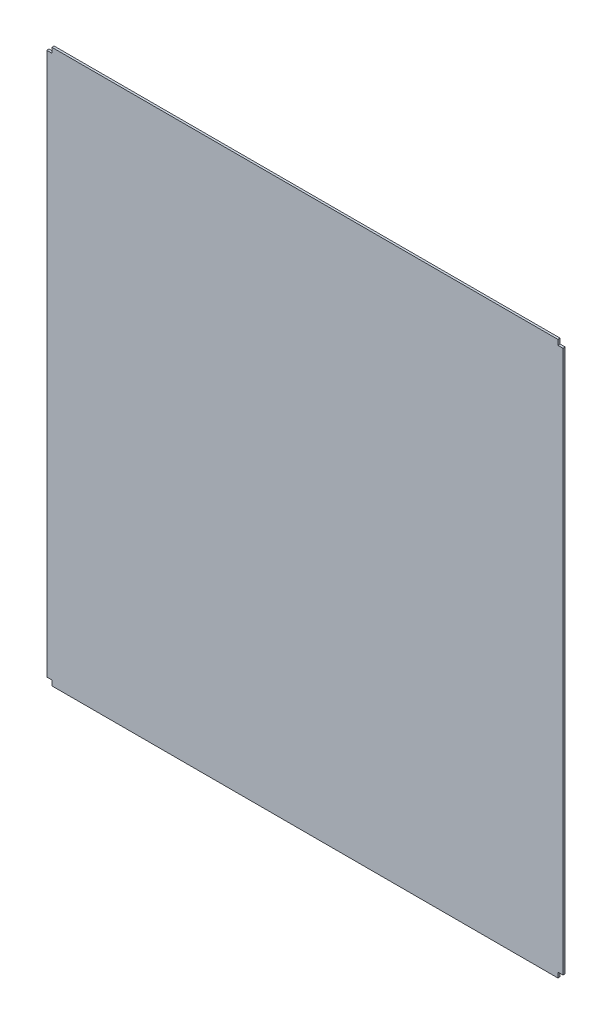
ISO-10303-21;
HEADER;
FILE_DESCRIPTION(('STEP AP214'),'2;1');
FILE_NAME('part.step','',(''),(''),'','','');
FILE_SCHEMA(('AUTOMOTIVE_DESIGN { 1 0 10303 214 1 1 1 1 }'));
ENDSEC;
DATA;
#1=APPLICATION_CONTEXT('core data for automotive mechanical design processes');
#2=APPLICATION_PROTOCOL_DEFINITION('international standard','automotive_design',2000,#1);
#3=PRODUCT_CONTEXT('',#1,'mechanical');
#4=PRODUCT('Part','Part','',(#3));
#5=PRODUCT_RELATED_PRODUCT_CATEGORY('part','',(#4));
#6=PRODUCT_DEFINITION_FORMATION('','',#4);
#7=PRODUCT_DEFINITION_CONTEXT('part definition',#1,'design');
#8=PRODUCT_DEFINITION('design','',#6,#7);
#9=PRODUCT_DEFINITION_SHAPE('','',#8);
#10=(LENGTH_UNIT() NAMED_UNIT(*) SI_UNIT(.MILLI.,.METRE.));
#11=(NAMED_UNIT(*) PLANE_ANGLE_UNIT() SI_UNIT($,.RADIAN.));
#12=(NAMED_UNIT(*) SI_UNIT($,.STERADIAN.) SOLID_ANGLE_UNIT());
#13=UNCERTAINTY_MEASURE_WITH_UNIT(LENGTH_MEASURE(1.E-05),#10,'distance_accuracy_value','');
#14=(GEOMETRIC_REPRESENTATION_CONTEXT(3) GLOBAL_UNCERTAINTY_ASSIGNED_CONTEXT((#13)) GLOBAL_UNIT_ASSIGNED_CONTEXT((#10,
#11,#12)) REPRESENTATION_CONTEXT('',''));
#15=CARTESIAN_POINT('',(0.,0.,0.));
#16=DIRECTION('',(0.,0.,1.));
#17=DIRECTION('',(1.,0.,0.));
#18=AXIS2_PLACEMENT_3D('',#15,#16,#17);
#19=CARTESIAN_POINT('',(350.,-675.,6.09036630651514E-13));
#20=DIRECTION('',(0.,0.,1.));
#21=DIRECTION('',(1.,0.,0.));
#22=AXIS2_PLACEMENT_3D('',#19,#20,#21);
#23=PLANE('',#22);
#24=DIRECTION('',(1.,0.,0.));
#25=VECTOR('',#24,1.);
#26=CARTESIAN_POINT('',(7.00000000000003,-1050.,1.12502540359956E-12));
#27=LINE('',#26,#25);
#28=CARTESIAN_POINT('',(7.00000000000001,-1050.,2.90070315688335E-13));
#29=VERTEX_POINT('',#28);
#30=CARTESIAN_POINT('',(693.,-1050.,1.44399171856274E-12));
#31=VERTEX_POINT('',#30);
#32=EDGE_CURVE('E174',#29,#31,#27,.T.);
#33=ORIENTED_EDGE('',*,*,#32,.F.);
#34=DIRECTION('',(0.,1.,0.));
#35=VECTOR('',#34,1.);
#36=CARTESIAN_POINT('',(7.,-1043.,1.12502540359956E-12));
#37=LINE('',#36,#35);
#38=CARTESIAN_POINT('',(7.,-1043.,-1.33294582363575E-13));
#39=VERTEX_POINT('',#38);
#40=EDGE_CURVE('E169',#39,#29,#37,.F.);
#41=ORIENTED_EDGE('',*,*,#40,.F.);
#42=DIRECTION('',(1.,0.,0.));
#43=VECTOR('',#42,1.);
#44=CARTESIAN_POINT('',(0.,-1043.,-5.6843418860808E-13));
#45=LINE('',#44,#43);
#46=CARTESIAN_POINT('',(0.,-1043.,-1.45069290556171E-13));
#47=VERTEX_POINT('',#46);
#48=EDGE_CURVE('E163',#47,#39,#45,.T.);
#49=ORIENTED_EDGE('',*,*,#48,.F.);
#50=DIRECTION('',(0.,1.,0.));
#51=VECTOR('',#50,1.);
#52=CARTESIAN_POINT('',(0.,-307.,1.12502540359956E-12));
#53=LINE('',#52,#51);
#54=CARTESIAN_POINT('',(0.,-307.,2.78295607495739E-13));
#55=VERTEX_POINT('',#54);
#56=EDGE_CURVE('E157',#55,#47,#53,.F.);
#57=ORIENTED_EDGE('',*,*,#56,.F.);
#58=DIRECTION('',(1.,0.,0.));
#59=VECTOR('',#58,1.);
#60=CARTESIAN_POINT('',(7.,-307.,1.12502540359956E-12));
#61=LINE('',#60,#59);
#62=CARTESIAN_POINT('',(7.00000000000001,-307.,2.90070315688335E-13));
#63=VERTEX_POINT('',#62);
#64=EDGE_CURVE('E151',#63,#55,#61,.F.);
#65=ORIENTED_EDGE('',*,*,#64,.F.);
#66=DIRECTION('',(0.,1.,0.));
#67=VECTOR('',#66,1.);
#68=CARTESIAN_POINT('',(7.,-300.,1.12502540359956E-12));
#69=LINE('',#68,#67);
#70=CARTESIAN_POINT('',(7.,-300.,-1.33294582363575E-13));
#71=VERTEX_POINT('',#70);
#72=EDGE_CURVE('E145',#71,#63,#69,.F.);
#73=ORIENTED_EDGE('',*,*,#72,.F.);
#74=DIRECTION('',(1.,0.,0.));
#75=VECTOR('',#74,1.);
#76=CARTESIAN_POINT('',(693.,-300.,-5.6843418860808E-13));
#77=LINE('',#76,#75);
#78=CARTESIAN_POINT('',(693.,-300.,1.02062682051083E-12));
#79=VERTEX_POINT('',#78);
#80=EDGE_CURVE('E139',#79,#71,#77,.F.);
#81=ORIENTED_EDGE('',*,*,#80,.F.);
#82=DIRECTION('',(0.,1.,0.));
#83=VECTOR('',#82,1.);
#84=CARTESIAN_POINT('',(693.,-307.,1.12502540359956E-12));
#85=LINE('',#84,#83);
#86=CARTESIAN_POINT('',(693.,-307.,1.44399171856274E-12));
#87=VERTEX_POINT('',#86);
#88=EDGE_CURVE('E133',#87,#79,#85,.T.);
#89=ORIENTED_EDGE('',*,*,#88,.F.);
#90=DIRECTION('',(1.,0.,0.));
#91=VECTOR('',#90,1.);
#92=CARTESIAN_POINT('',(700.,-307.,1.12502540359956E-12));
#93=LINE('',#92,#91);
#94=CARTESIAN_POINT('',(700.,-307.,1.45576642675533E-12));
#95=VERTEX_POINT('',#94);
#96=EDGE_CURVE('E127',#95,#87,#93,.F.);
#97=ORIENTED_EDGE('',*,*,#96,.F.);
#98=DIRECTION('',(0.,1.,0.));
#99=VECTOR('',#98,1.);
#100=CARTESIAN_POINT('',(700.,-1043.,1.12502540359956E-12));
#101=LINE('',#100,#99);
#102=CARTESIAN_POINT('',(700.,-1043.,1.03240152870342E-12));
#103=VERTEX_POINT('',#102);
#104=EDGE_CURVE('E103',#103,#95,#101,.T.);
#105=ORIENTED_EDGE('',*,*,#104,.F.);
#106=DIRECTION('',(1.,0.,0.));
#107=VECTOR('',#106,1.);
#108=CARTESIAN_POINT('',(693.,-1043.,-5.6843418860808E-13));
#109=LINE('',#108,#107);
#110=CARTESIAN_POINT('',(693.,-1043.,1.02062682051083E-12));
#111=VERTEX_POINT('',#110);
#112=EDGE_CURVE('E105',#111,#103,#109,.T.);
#113=ORIENTED_EDGE('',*,*,#112,.F.);
#114=DIRECTION('',(0.,1.,0.));
#115=VECTOR('',#114,1.);
#116=CARTESIAN_POINT('',(693.,-1050.,1.12502540359956E-12));
#117=LINE('',#116,#115);
#118=EDGE_CURVE('E19',#31,#111,#117,.T.);
#119=ORIENTED_EDGE('',*,*,#118,.F.);
#120=EDGE_LOOP('',(#33,#41,#49,#57,#65,#73,#81,#89,#97,#105,#113,#119));
#121=FACE_BOUND('',#120,.T.);
#122=ADVANCED_FACE('F16',(#121),#23,.F.);
#123=CARTESIAN_POINT('',(693.,-1050.,1.12502540359956E-12));
#124=DIRECTION('',(1.,0.,0.));
#125=DIRECTION('',(0.,0.,-1.));
#126=AXIS2_PLACEMENT_3D('',#123,#124,#125);
#127=PLANE('',#126);
#128=DIRECTION('',(0.,1.,0.));
#129=VECTOR('',#128,1.);
#130=CARTESIAN_POINT('',(693.,-675.,3.00000000000113));
#131=LINE('',#130,#129);
#132=CARTESIAN_POINT('',(693.,-1050.,3.00000000000028));
#133=VERTEX_POINT('',#132);
#134=CARTESIAN_POINT('',(693.,-1043.,3.00000000000028));
#135=VERTEX_POINT('',#134);
#136=EDGE_CURVE('E178',#133,#135,#131,.T.);
#137=ORIENTED_EDGE('',*,*,#136,.F.);
#138=DIRECTION('',(0.,0.,-1.));
#139=VECTOR('',#138,1.);
#140=CARTESIAN_POINT('',(693.,-1050.,1.78650744991111E-12));
#141=LINE('',#140,#139);
#142=EDGE_CURVE('E116',#31,#133,#141,.F.);
#143=ORIENTED_EDGE('',*,*,#142,.F.);
#144=ORIENTED_EDGE('',*,*,#118,.T.);
#145=DIRECTION('',(0.,0.,-1.));
#146=VECTOR('',#145,1.);
#147=CARTESIAN_POINT('',(693.,-1043.,-5.6843418860808E-13));
#148=LINE('',#147,#146);
#149=EDGE_CURVE('E111',#135,#111,#148,.T.);
#150=ORIENTED_EDGE('',*,*,#149,.F.);
#151=EDGE_LOOP('',(#137,#143,#144,#150));
#152=FACE_BOUND('',#151,.T.);
#153=ADVANCED_FACE('F113',(#152),#127,.T.);
#154=CARTESIAN_POINT('',(693.,-1043.,-5.6843418860808E-13));
#155=DIRECTION('',(0.,-1.,0.));
#156=DIRECTION('',(0.,0.,-1.));
#157=AXIS2_PLACEMENT_3D('',#154,#155,#156);
#158=PLANE('',#157);
#159=DIRECTION('',(1.,0.,0.));
#160=VECTOR('',#159,1.);
#161=CARTESIAN_POINT('',(350.,-1043.,3.00000000000113));
#162=LINE('',#161,#160);
#163=CARTESIAN_POINT('',(700.,-1043.,3.00000000000113));
#164=VERTEX_POINT('',#163);
#165=EDGE_CURVE('E120',#135,#164,#162,.T.);
#166=ORIENTED_EDGE('',*,*,#165,.F.);
#167=ORIENTED_EDGE('',*,*,#149,.T.);
#168=ORIENTED_EDGE('',*,*,#112,.T.);
#169=DIRECTION('',(0.,0.,-1.));
#170=VECTOR('',#169,1.);
#171=CARTESIAN_POINT('',(700.,-1043.,1.78650744991111E-12));
#172=LINE('',#171,#170);
#173=EDGE_CURVE('E123',#164,#103,#172,.T.);
#174=ORIENTED_EDGE('',*,*,#173,.F.);
#175=EDGE_LOOP('',(#166,#167,#168,#174));
#176=FACE_BOUND('',#175,.T.);
#177=ADVANCED_FACE('F118',(#176),#158,.T.);
#178=CARTESIAN_POINT('',(700.,-1043.,1.78650744991111E-12));
#179=DIRECTION('',(1.,0.,0.));
#180=DIRECTION('',(0.,0.,-1.));
#181=AXIS2_PLACEMENT_3D('',#178,#179,#180);
#182=PLANE('',#181);
#183=DIRECTION('',(0.,1.,0.));
#184=VECTOR('',#183,1.);
#185=CARTESIAN_POINT('',(700.,-675.,3.00000000000113));
#186=LINE('',#185,#184);
#187=CARTESIAN_POINT('',(700.,-307.,3.00000000000113));
#188=VERTEX_POINT('',#187);
#189=EDGE_CURVE('E181',#164,#188,#186,.T.);
#190=ORIENTED_EDGE('',*,*,#189,.F.);
#191=ORIENTED_EDGE('',*,*,#173,.T.);
#192=ORIENTED_EDGE('',*,*,#104,.T.);
#193=DIRECTION('',(0.,0.,1.));
#194=VECTOR('',#193,1.);
#195=CARTESIAN_POINT('',(700.,-307.,1.12502540359956E-12));
#196=LINE('',#195,#194);
#197=EDGE_CURVE('E130',#188,#95,#196,.F.);
#198=ORIENTED_EDGE('',*,*,#197,.F.);
#199=EDGE_LOOP('',(#190,#191,#192,#198));
#200=FACE_BOUND('',#199,.T.);
#201=ADVANCED_FACE('F232',(#200),#182,.T.);
#202=CARTESIAN_POINT('',(700.,-307.,1.12502540359956E-12));
#203=DIRECTION('',(0.,1.,0.));
#204=DIRECTION('',(0.,0.,1.));
#205=AXIS2_PLACEMENT_3D('',#202,#203,#204);
#206=PLANE('',#205);
#207=DIRECTION('',(1.,0.,0.));
#208=VECTOR('',#207,1.);
#209=CARTESIAN_POINT('',(350.,-307.,3.00000000000113));
#210=LINE('',#209,#208);
#211=CARTESIAN_POINT('',(693.,-307.,3.00000000000071));
#212=VERTEX_POINT('',#211);
#213=EDGE_CURVE('E184',#188,#212,#210,.F.);
#214=ORIENTED_EDGE('',*,*,#213,.F.);
#215=ORIENTED_EDGE('',*,*,#197,.T.);
#216=ORIENTED_EDGE('',*,*,#96,.T.);
#217=DIRECTION('',(0.,0.,-1.));
#218=VECTOR('',#217,1.);
#219=CARTESIAN_POINT('',(693.,-307.,1.12502540359956E-12));
#220=LINE('',#219,#218);
#221=EDGE_CURVE('E136',#212,#87,#220,.T.);
#222=ORIENTED_EDGE('',*,*,#221,.F.);
#223=EDGE_LOOP('',(#214,#215,#216,#222));
#224=FACE_BOUND('',#223,.T.);
#225=ADVANCED_FACE('F229',(#224),#206,.T.);
#226=CARTESIAN_POINT('',(693.,-307.,1.12502540359956E-12));
#227=DIRECTION('',(1.,0.,0.));
#228=DIRECTION('',(0.,0.,-1.));
#229=AXIS2_PLACEMENT_3D('',#226,#227,#228);
#230=PLANE('',#229);
#231=DIRECTION('',(0.,1.,0.));
#232=VECTOR('',#231,1.);
#233=CARTESIAN_POINT('',(693.,-675.,3.00000000000113));
#234=LINE('',#233,#232);
#235=CARTESIAN_POINT('',(693.,-300.,3.00000000000028));
#236=VERTEX_POINT('',#235);
#237=EDGE_CURVE('E187',#212,#236,#234,.T.);
#238=ORIENTED_EDGE('',*,*,#237,.F.);
#239=ORIENTED_EDGE('',*,*,#221,.T.);
#240=ORIENTED_EDGE('',*,*,#88,.T.);
#241=DIRECTION('',(0.,0.,1.));
#242=VECTOR('',#241,1.);
#243=CARTESIAN_POINT('',(693.,-300.,1.76295803352592E-12));
#244=LINE('',#243,#242);
#245=EDGE_CURVE('E142',#236,#79,#244,.F.);
#246=ORIENTED_EDGE('',*,*,#245,.F.);
#247=EDGE_LOOP('',(#238,#239,#240,#246));
#248=FACE_BOUND('',#247,.T.);
#249=ADVANCED_FACE('F226',(#248),#230,.T.);
#250=CARTESIAN_POINT('',(693.,-300.,1.76295803352592E-12));
#251=DIRECTION('',(0.,1.,0.));
#252=DIRECTION('',(0.,0.,1.));
#253=AXIS2_PLACEMENT_3D('',#250,#251,#252);
#254=PLANE('',#253);
#255=DIRECTION('',(1.,0.,0.));
#256=VECTOR('',#255,1.);
#257=CARTESIAN_POINT('',(350.,-300.,3.00000000000113));
#258=LINE('',#257,#256);
#259=CARTESIAN_POINT('',(7.,-300.,3.00000000000113));
#260=VERTEX_POINT('',#259);
#261=EDGE_CURVE('E190',#236,#260,#258,.F.);
#262=ORIENTED_EDGE('',*,*,#261,.F.);
#263=ORIENTED_EDGE('',*,*,#245,.T.);
#264=ORIENTED_EDGE('',*,*,#80,.T.);
#265=DIRECTION('',(0.,0.,1.));
#266=VECTOR('',#265,1.);
#267=CARTESIAN_POINT('',(7.,-300.,1.12502540359956E-12));
#268=LINE('',#267,#266);
#269=EDGE_CURVE('E148',#260,#71,#268,.F.);
#270=ORIENTED_EDGE('',*,*,#269,.F.);
#271=EDGE_LOOP('',(#262,#263,#264,#270));
#272=FACE_BOUND('',#271,.T.);
#273=ADVANCED_FACE('F223',(#272),#254,.T.);
#274=CARTESIAN_POINT('',(7.,-300.,1.12502540359956E-12));
#275=DIRECTION('',(-1.,0.,0.));
#276=DIRECTION('',(0.,0.,1.));
#277=AXIS2_PLACEMENT_3D('',#274,#275,#276);
#278=PLANE('',#277);
#279=DIRECTION('',(0.,1.,0.));
#280=VECTOR('',#279,1.);
#281=CARTESIAN_POINT('',(7.00000000000001,-675.,3.00000000000113));
#282=LINE('',#281,#280);
#283=CARTESIAN_POINT('',(7.00000000000001,-307.,3.00000000000113));
#284=VERTEX_POINT('',#283);
#285=EDGE_CURVE('E193',#260,#284,#282,.F.);
#286=ORIENTED_EDGE('',*,*,#285,.F.);
#287=ORIENTED_EDGE('',*,*,#269,.T.);
#288=ORIENTED_EDGE('',*,*,#72,.T.);
#289=DIRECTION('',(0.,0.,1.));
#290=VECTOR('',#289,1.);
#291=CARTESIAN_POINT('',(7.00000000000003,-307.,1.12502540359956E-12));
#292=LINE('',#291,#290);
#293=EDGE_CURVE('E154',#284,#63,#292,.F.);
#294=ORIENTED_EDGE('',*,*,#293,.F.);
#295=EDGE_LOOP('',(#286,#287,#288,#294));
#296=FACE_BOUND('',#295,.T.);
#297=ADVANCED_FACE('F220',(#296),#278,.T.);
#298=CARTESIAN_POINT('',(7.,-307.,1.12502540359956E-12));
#299=DIRECTION('',(0.,1.,0.));
#300=DIRECTION('',(0.,0.,1.));
#301=AXIS2_PLACEMENT_3D('',#298,#299,#300);
#302=PLANE('',#301);
#303=DIRECTION('',(1.,0.,0.));
#304=VECTOR('',#303,1.);
#305=CARTESIAN_POINT('',(350.,-307.,3.00000000000113));
#306=LINE('',#305,#304);
#307=CARTESIAN_POINT('',(0.,-307.,3.00000000000071));
#308=VERTEX_POINT('',#307);
#309=EDGE_CURVE('E196',#284,#308,#306,.F.);
#310=ORIENTED_EDGE('',*,*,#309,.F.);
#311=ORIENTED_EDGE('',*,*,#293,.T.);
#312=ORIENTED_EDGE('',*,*,#64,.T.);
#313=DIRECTION('',(0.,0.,1.));
#314=VECTOR('',#313,1.);
#315=CARTESIAN_POINT('',(0.,-307.,-5.46454733315234E-13));
#316=LINE('',#315,#314);
#317=EDGE_CURVE('E160',#308,#55,#316,.F.);
#318=ORIENTED_EDGE('',*,*,#317,.F.);
#319=EDGE_LOOP('',(#310,#311,#312,#318));
#320=FACE_BOUND('',#319,.T.);
#321=ADVANCED_FACE('F217',(#320),#302,.T.);
#322=CARTESIAN_POINT('',(0.,-307.,-5.46454733315234E-13));
#323=DIRECTION('',(-1.,0.,0.));
#324=DIRECTION('',(0.,0.,1.));
#325=AXIS2_PLACEMENT_3D('',#322,#323,#324);
#326=PLANE('',#325);
#327=DIRECTION('',(0.,1.,0.));
#328=VECTOR('',#327,1.);
#329=CARTESIAN_POINT('',(0.,-675.,3.00000000000113));
#330=LINE('',#329,#328);
#331=CARTESIAN_POINT('',(0.,-1043.,3.00000000000028));
#332=VERTEX_POINT('',#331);
#333=EDGE_CURVE('E199',#308,#332,#330,.F.);
#334=ORIENTED_EDGE('',*,*,#333,.F.);
#335=ORIENTED_EDGE('',*,*,#317,.T.);
#336=ORIENTED_EDGE('',*,*,#56,.T.);
#337=DIRECTION('',(0.,0.,-1.));
#338=VECTOR('',#337,1.);
#339=CARTESIAN_POINT('',(0.,-1043.,-5.6843418860808E-13));
#340=LINE('',#339,#338);
#341=EDGE_CURVE('E166',#332,#47,#340,.T.);
#342=ORIENTED_EDGE('',*,*,#341,.F.);
#343=EDGE_LOOP('',(#334,#335,#336,#342));
#344=FACE_BOUND('',#343,.T.);
#345=ADVANCED_FACE('F214',(#344),#326,.T.);
#346=CARTESIAN_POINT('',(0.,-1043.,-5.6843418860808E-13));
#347=DIRECTION('',(0.,-1.,0.));
#348=DIRECTION('',(0.,0.,-1.));
#349=AXIS2_PLACEMENT_3D('',#346,#347,#348);
#350=PLANE('',#349);
#351=DIRECTION('',(1.,0.,0.));
#352=VECTOR('',#351,1.);
#353=CARTESIAN_POINT('',(350.,-1043.,3.00000000000113));
#354=LINE('',#353,#352);
#355=CARTESIAN_POINT('',(7.,-1043.,3.00000000000113));
#356=VERTEX_POINT('',#355);
#357=EDGE_CURVE('E202',#332,#356,#354,.T.);
#358=ORIENTED_EDGE('',*,*,#357,.F.);
#359=ORIENTED_EDGE('',*,*,#341,.T.);
#360=ORIENTED_EDGE('',*,*,#48,.T.);
#361=DIRECTION('',(0.,0.,1.));
#362=VECTOR('',#361,1.);
#363=CARTESIAN_POINT('',(7.,-1043.,1.12502540359956E-12));
#364=LINE('',#363,#362);
#365=EDGE_CURVE('E171',#356,#39,#364,.F.);
#366=ORIENTED_EDGE('',*,*,#365,.F.);
#367=EDGE_LOOP('',(#358,#359,#360,#366));
#368=FACE_BOUND('',#367,.T.);
#369=ADVANCED_FACE('F211',(#368),#350,.T.);
#370=CARTESIAN_POINT('',(7.,-1043.,1.12502540359956E-12));
#371=DIRECTION('',(-1.,0.,0.));
#372=DIRECTION('',(0.,0.,1.));
#373=AXIS2_PLACEMENT_3D('',#370,#371,#372);
#374=PLANE('',#373);
#375=DIRECTION('',(0.,1.,0.));
#376=VECTOR('',#375,1.);
#377=CARTESIAN_POINT('',(7.00000000000001,-675.,3.00000000000113));
#378=LINE('',#377,#376);
#379=CARTESIAN_POINT('',(7.00000000000001,-1050.,3.00000000000113));
#380=VERTEX_POINT('',#379);
#381=EDGE_CURVE('E25',#356,#380,#378,.F.);
#382=ORIENTED_EDGE('',*,*,#381,.F.);
#383=ORIENTED_EDGE('',*,*,#365,.T.);
#384=ORIENTED_EDGE('',*,*,#40,.T.);
#385=DIRECTION('',(0.,0.,-1.));
#386=VECTOR('',#385,1.);
#387=CARTESIAN_POINT('',(7.00000000000003,-1050.,1.78650744991111E-12));
#388=LINE('',#387,#386);
#389=EDGE_CURVE('E34',#380,#29,#388,.T.);
#390=ORIENTED_EDGE('',*,*,#389,.F.);
#391=EDGE_LOOP('',(#382,#383,#384,#390));
#392=FACE_BOUND('',#391,.T.);
#393=ADVANCED_FACE('F209',(#392),#374,.T.);
#394=CARTESIAN_POINT('',(7.00000000000003,-1050.,1.78650744991111E-12));
#395=DIRECTION('',(0.,-1.,0.));
#396=DIRECTION('',(0.,0.,-1.));
#397=AXIS2_PLACEMENT_3D('',#394,#395,#396);
#398=PLANE('',#397);
#399=DIRECTION('',(1.,0.,0.));
#400=VECTOR('',#399,1.);
#401=CARTESIAN_POINT('',(350.,-1050.,3.00000000000113));
#402=LINE('',#401,#400);
#403=EDGE_CURVE('E11',#380,#133,#402,.T.);
#404=ORIENTED_EDGE('',*,*,#403,.F.);
#405=ORIENTED_EDGE('',*,*,#389,.T.);
#406=ORIENTED_EDGE('',*,*,#32,.T.);
#407=ORIENTED_EDGE('',*,*,#142,.T.);
#408=EDGE_LOOP('',(#404,#405,#406,#407));
#409=FACE_BOUND('',#408,.T.);
#410=ADVANCED_FACE('F234',(#409),#398,.T.);
#411=CARTESIAN_POINT('',(350.,-675.,3.00000000000113));
#412=DIRECTION('',(0.,0.,1.));
#413=DIRECTION('',(1.,0.,0.));
#414=AXIS2_PLACEMENT_3D('',#411,#412,#413);
#415=PLANE('',#414);
#416=ORIENTED_EDGE('',*,*,#381,.T.);
#417=ORIENTED_EDGE('',*,*,#403,.T.);
#418=ORIENTED_EDGE('',*,*,#136,.T.);
#419=ORIENTED_EDGE('',*,*,#165,.T.);
#420=ORIENTED_EDGE('',*,*,#189,.T.);
#421=ORIENTED_EDGE('',*,*,#213,.T.);
#422=ORIENTED_EDGE('',*,*,#237,.T.);
#423=ORIENTED_EDGE('',*,*,#261,.T.);
#424=ORIENTED_EDGE('',*,*,#285,.T.);
#425=ORIENTED_EDGE('',*,*,#309,.T.);
#426=ORIENTED_EDGE('',*,*,#333,.T.);
#427=ORIENTED_EDGE('',*,*,#357,.T.);
#428=EDGE_LOOP('',(#416,#417,#418,#419,#420,#421,#422,#423,#424,#425,#426,#427));
#429=FACE_BOUND('',#428,.T.);
#430=ADVANCED_FACE('F207',(#429),#415,.T.);
#431=CLOSED_SHELL('',(#122,#153,#177,#201,#225,#249,#273,#297,#321,#345,#369,#393,#410,#430));
#432=MANIFOLD_SOLID_BREP('B1',#431);
#433=ADVANCED_BREP_SHAPE_REPRESENTATION('',(#18,#432),#14);
#434=SHAPE_DEFINITION_REPRESENTATION(#9,#433);
ENDSEC;
END-ISO-10303-21;
